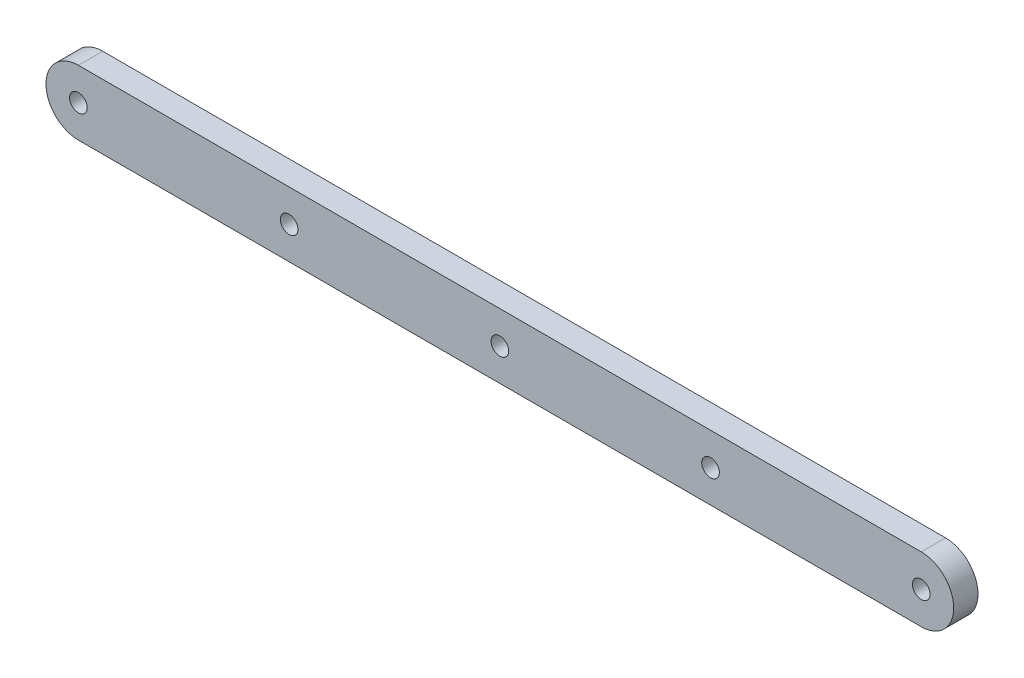
ISO-10303-21;
HEADER;
FILE_DESCRIPTION(('STEP AP214'),'2;1');
FILE_NAME('part.step','',(''),(''),'','','');
FILE_SCHEMA(('AUTOMOTIVE_DESIGN { 1 0 10303 214 1 1 1 1 }'));
ENDSEC;
DATA;
#1=APPLICATION_CONTEXT('core data for automotive mechanical design processes');
#2=APPLICATION_PROTOCOL_DEFINITION('international standard','automotive_design',2000,#1);
#3=PRODUCT_CONTEXT('',#1,'mechanical');
#4=PRODUCT('Part','Part','',(#3));
#5=PRODUCT_RELATED_PRODUCT_CATEGORY('part','',(#4));
#6=PRODUCT_DEFINITION_FORMATION('','',#4);
#7=PRODUCT_DEFINITION_CONTEXT('part definition',#1,'design');
#8=PRODUCT_DEFINITION('design','',#6,#7);
#9=PRODUCT_DEFINITION_SHAPE('','',#8);
#10=(LENGTH_UNIT() NAMED_UNIT(*) SI_UNIT(.MILLI.,.METRE.));
#11=(NAMED_UNIT(*) PLANE_ANGLE_UNIT() SI_UNIT($,.RADIAN.));
#12=(NAMED_UNIT(*) SI_UNIT($,.STERADIAN.) SOLID_ANGLE_UNIT());
#13=UNCERTAINTY_MEASURE_WITH_UNIT(LENGTH_MEASURE(1.E-05),#10,'distance_accuracy_value','');
#14=(GEOMETRIC_REPRESENTATION_CONTEXT(3) GLOBAL_UNCERTAINTY_ASSIGNED_CONTEXT((#13)) GLOBAL_UNIT_ASSIGNED_CONTEXT((#10,
#11,#12)) REPRESENTATION_CONTEXT('',''));
#15=CARTESIAN_POINT('',(0.,0.,0.));
#16=DIRECTION('',(0.,0.,1.));
#17=DIRECTION('',(1.,0.,0.));
#18=AXIS2_PLACEMENT_3D('',#15,#16,#17);
#19=CARTESIAN_POINT('',(82.55,6.35,4.7625));
#20=DIRECTION('',(0.,0.,-1.));
#21=DIRECTION('',(-1.,0.,0.));
#22=AXIS2_PLACEMENT_3D('',#19,#20,#21);
#23=CYLINDRICAL_SURFACE('',#22,6.35);
#24=CARTESIAN_POINT('',(82.55,6.35,0.));
#25=DIRECTION('',(0.,0.,1.));
#26=DIRECTION('',(1.,0.,0.));
#27=AXIS2_PLACEMENT_3D('',#24,#25,#26);
#28=CIRCLE('',#27,6.35);
#29=CARTESIAN_POINT('',(82.55,0.,0.));
#30=VERTEX_POINT('',#29);
#31=CARTESIAN_POINT('',(82.55,12.7,0.));
#32=VERTEX_POINT('',#31);
#33=EDGE_CURVE('E103',#30,#32,#28,.T.);
#34=ORIENTED_EDGE('',*,*,#33,.T.);
#35=DIRECTION('',(0.,0.,-1.));
#36=VECTOR('',#35,1.);
#37=CARTESIAN_POINT('',(82.55,12.7,4.7625));
#38=LINE('',#37,#36);
#39=CARTESIAN_POINT('',(82.55,12.7,4.7625));
#40=VERTEX_POINT('',#39);
#41=EDGE_CURVE('E11',#40,#32,#38,.T.);
#42=ORIENTED_EDGE('',*,*,#41,.F.);
#43=CARTESIAN_POINT('',(82.55,6.35,4.7625));
#44=DIRECTION('',(0.,0.,1.));
#45=DIRECTION('',(1.,0.,0.));
#46=AXIS2_PLACEMENT_3D('',#43,#44,#45);
#47=CIRCLE('',#46,6.35);
#48=CARTESIAN_POINT('',(82.55,0.,4.7625));
#49=VERTEX_POINT('',#48);
#50=EDGE_CURVE('E90',#49,#40,#47,.T.);
#51=ORIENTED_EDGE('',*,*,#50,.F.);
#52=DIRECTION('',(0.,0.,-1.));
#53=VECTOR('',#52,1.);
#54=CARTESIAN_POINT('',(82.55,0.,4.7625));
#55=LINE('',#54,#53);
#56=EDGE_CURVE('E99',#49,#30,#55,.T.);
#57=ORIENTED_EDGE('',*,*,#56,.T.);
#58=EDGE_LOOP('',(#34,#42,#51,#57));
#59=FACE_BOUND('',#58,.T.);
#60=ADVANCED_FACE('F37',(#59),#23,.T.);
#61=CARTESIAN_POINT('',(-82.55,12.7,4.7625));
#62=DIRECTION('',(0.,-1.,0.));
#63=DIRECTION('',(0.,0.,-1.));
#64=AXIS2_PLACEMENT_3D('',#61,#62,#63);
#65=PLANE('',#64);
#66=DIRECTION('',(-1.,0.,0.));
#67=VECTOR('',#66,1.);
#68=CARTESIAN_POINT('',(-82.55,12.7,0.));
#69=LINE('',#68,#67);
#70=CARTESIAN_POINT('',(-82.55,12.7,0.));
#71=VERTEX_POINT('',#70);
#72=EDGE_CURVE('E94',#32,#71,#69,.T.);
#73=ORIENTED_EDGE('',*,*,#72,.T.);
#74=DIRECTION('',(0.,0.,-1.));
#75=VECTOR('',#74,1.);
#76=CARTESIAN_POINT('',(-82.55,12.7,4.7625));
#77=LINE('',#76,#75);
#78=CARTESIAN_POINT('',(-82.55,12.7,4.7625));
#79=VERTEX_POINT('',#78);
#80=EDGE_CURVE('E46',#79,#71,#77,.T.);
#81=ORIENTED_EDGE('',*,*,#80,.F.);
#82=DIRECTION('',(-1.,0.,0.));
#83=VECTOR('',#82,1.);
#84=CARTESIAN_POINT('',(-82.55,12.7,4.7625));
#85=LINE('',#84,#83);
#86=EDGE_CURVE('E85',#40,#79,#85,.T.);
#87=ORIENTED_EDGE('',*,*,#86,.F.);
#88=ORIENTED_EDGE('',*,*,#41,.T.);
#89=EDGE_LOOP('',(#73,#81,#87,#88));
#90=FACE_BOUND('',#89,.T.);
#91=ADVANCED_FACE('F93',(#90),#65,.F.);
#92=CARTESIAN_POINT('',(-82.55,6.35,4.7625));
#93=DIRECTION('',(0.,0.,-1.));
#94=DIRECTION('',(-1.,0.,0.));
#95=AXIS2_PLACEMENT_3D('',#92,#93,#94);
#96=CYLINDRICAL_SURFACE('',#95,6.35);
#97=CARTESIAN_POINT('',(-82.55,6.35,0.));
#98=DIRECTION('',(0.,0.,1.));
#99=DIRECTION('',(-1.,0.,0.));
#100=AXIS2_PLACEMENT_3D('',#97,#98,#99);
#101=CIRCLE('',#100,6.35);
#102=CARTESIAN_POINT('',(-82.55,0.,0.));
#103=VERTEX_POINT('',#102);
#104=EDGE_CURVE('E72',#71,#103,#101,.T.);
#105=ORIENTED_EDGE('',*,*,#104,.T.);
#106=DIRECTION('',(0.,0.,-1.));
#107=VECTOR('',#106,1.);
#108=CARTESIAN_POINT('',(-82.55,0.,4.7625));
#109=LINE('',#108,#107);
#110=CARTESIAN_POINT('',(-82.55,0.,4.7625));
#111=VERTEX_POINT('',#110);
#112=EDGE_CURVE('E95',#111,#103,#109,.T.);
#113=ORIENTED_EDGE('',*,*,#112,.F.);
#114=CARTESIAN_POINT('',(-82.55,6.35,4.7625));
#115=DIRECTION('',(0.,0.,1.));
#116=DIRECTION('',(-1.,0.,0.));
#117=AXIS2_PLACEMENT_3D('',#114,#115,#116);
#118=CIRCLE('',#117,6.35);
#119=EDGE_CURVE('E88',#79,#111,#118,.T.);
#120=ORIENTED_EDGE('',*,*,#119,.F.);
#121=ORIENTED_EDGE('',*,*,#80,.T.);
#122=EDGE_LOOP('',(#105,#113,#120,#121));
#123=FACE_BOUND('',#122,.T.);
#124=ADVANCED_FACE('F97',(#123),#96,.T.);
#125=CARTESIAN_POINT('',(-82.55,0.,4.7625));
#126=DIRECTION('',(0.,1.,0.));
#127=DIRECTION('',(0.,0.,1.));
#128=AXIS2_PLACEMENT_3D('',#125,#126,#127);
#129=PLANE('',#128);
#130=DIRECTION('',(1.,0.,0.));
#131=VECTOR('',#130,1.);
#132=CARTESIAN_POINT('',(-82.55,0.,0.));
#133=LINE('',#132,#131);
#134=EDGE_CURVE('E78',#103,#30,#133,.T.);
#135=ORIENTED_EDGE('',*,*,#134,.T.);
#136=ORIENTED_EDGE('',*,*,#56,.F.);
#137=DIRECTION('',(1.,0.,0.));
#138=VECTOR('',#137,1.);
#139=CARTESIAN_POINT('',(-82.55,0.,4.7625));
#140=LINE('',#139,#138);
#141=EDGE_CURVE('E55',#111,#49,#140,.T.);
#142=ORIENTED_EDGE('',*,*,#141,.F.);
#143=ORIENTED_EDGE('',*,*,#112,.T.);
#144=EDGE_LOOP('',(#135,#136,#142,#143));
#145=FACE_BOUND('',#144,.T.);
#146=ADVANCED_FACE('F147',(#145),#129,.F.);
#147=CARTESIAN_POINT('',(82.55,6.35,4.7625));
#148=DIRECTION('',(0.,0.,1.));
#149=DIRECTION('',(1.,0.,0.));
#150=AXIS2_PLACEMENT_3D('',#147,#148,#149);
#151=PLANE('',#150);
#152=CARTESIAN_POINT('',(-82.55,6.35,4.7625));
#153=DIRECTION('',(0.,0.,1.));
#154=DIRECTION('',(1.,0.,0.));
#155=AXIS2_PLACEMENT_3D('',#152,#153,#154);
#156=CIRCLE('',#155,1.72719999999998);
#157=CARTESIAN_POINT('',(-80.8228,6.35,4.7625));
#158=VERTEX_POINT('',#157);
#159=EDGE_CURVE('E131',#158,#158,#156,.T.);
#160=ORIENTED_EDGE('',*,*,#159,.F.);
#161=EDGE_LOOP('',(#160));
#162=FACE_BOUND('',#161,.T.);
#163=CARTESIAN_POINT('',(82.55,6.35,4.7625));
#164=DIRECTION('',(0.,0.,1.));
#165=DIRECTION('',(1.,0.,0.));
#166=AXIS2_PLACEMENT_3D('',#163,#164,#165);
#167=CIRCLE('',#166,1.72719999999998);
#168=CARTESIAN_POINT('',(84.2772,6.35,4.7625));
#169=VERTEX_POINT('',#168);
#170=EDGE_CURVE('E121',#169,#169,#167,.T.);
#171=ORIENTED_EDGE('',*,*,#170,.F.);
#172=EDGE_LOOP('',(#171));
#173=FACE_BOUND('',#172,.T.);
#174=CARTESIAN_POINT('',(0.,6.35,4.7625));
#175=DIRECTION('',(0.,0.,1.));
#176=DIRECTION('',(1.,0.,0.));
#177=AXIS2_PLACEMENT_3D('',#174,#175,#176);
#178=CIRCLE('',#177,1.72719999999999);
#179=CARTESIAN_POINT('',(1.72719999999999,6.35,4.7625));
#180=VERTEX_POINT('',#179);
#181=EDGE_CURVE('E118',#180,#180,#178,.T.);
#182=ORIENTED_EDGE('',*,*,#181,.F.);
#183=EDGE_LOOP('',(#182));
#184=FACE_BOUND('',#183,.T.);
#185=CARTESIAN_POINT('',(41.2715213799497,6.35,4.7625));
#186=DIRECTION('',(0.,0.,1.));
#187=DIRECTION('',(1.,0.,0.));
#188=AXIS2_PLACEMENT_3D('',#185,#186,#187);
#189=CIRCLE('',#188,1.72719999999999);
#190=CARTESIAN_POINT('',(42.9987213799497,6.35,4.7625));
#191=VERTEX_POINT('',#190);
#192=EDGE_CURVE('E117',#191,#191,#189,.T.);
#193=ORIENTED_EDGE('',*,*,#192,.F.);
#194=EDGE_LOOP('',(#193));
#195=FACE_BOUND('',#194,.T.);
#196=CARTESIAN_POINT('',(-41.2760709235401,6.35,4.7625));
#197=DIRECTION('',(0.,0.,1.));
#198=DIRECTION('',(1.,0.,0.));
#199=AXIS2_PLACEMENT_3D('',#196,#197,#198);
#200=CIRCLE('',#199,1.72719999999999);
#201=CARTESIAN_POINT('',(-39.5488709235401,6.35,4.7625));
#202=VERTEX_POINT('',#201);
#203=EDGE_CURVE('E114',#202,#202,#200,.T.);
#204=ORIENTED_EDGE('',*,*,#203,.F.);
#205=EDGE_LOOP('',(#204));
#206=FACE_BOUND('',#205,.T.);
#207=ORIENTED_EDGE('',*,*,#50,.T.);
#208=ORIENTED_EDGE('',*,*,#86,.T.);
#209=ORIENTED_EDGE('',*,*,#119,.T.);
#210=ORIENTED_EDGE('',*,*,#141,.T.);
#211=EDGE_LOOP('',(#207,#208,#209,#210));
#212=FACE_BOUND('',#211,.T.);
#213=ADVANCED_FACE('F86',(#162,#173,#184,#195,#206,#212),#151,.T.);
#214=CARTESIAN_POINT('',(82.55,6.35,0.));
#215=DIRECTION('',(0.,0.,1.));
#216=DIRECTION('',(1.,0.,0.));
#217=AXIS2_PLACEMENT_3D('',#214,#215,#216);
#218=PLANE('',#217);
#219=CARTESIAN_POINT('',(-82.55,6.35,0.));
#220=DIRECTION('',(0.,0.,1.));
#221=DIRECTION('',(1.,0.,0.));
#222=AXIS2_PLACEMENT_3D('',#219,#220,#221);
#223=CIRCLE('',#222,1.72719999999998);
#224=CARTESIAN_POINT('',(-80.8228,6.35,0.));
#225=VERTEX_POINT('',#224);
#226=EDGE_CURVE('E40',#225,#225,#223,.T.);
#227=ORIENTED_EDGE('',*,*,#226,.T.);
#228=EDGE_LOOP('',(#227));
#229=FACE_BOUND('',#228,.T.);
#230=CARTESIAN_POINT('',(82.55,6.35,0.));
#231=DIRECTION('',(0.,0.,1.));
#232=DIRECTION('',(1.,0.,0.));
#233=AXIS2_PLACEMENT_3D('',#230,#231,#232);
#234=CIRCLE('',#233,1.72719999999998);
#235=CARTESIAN_POINT('',(84.2772,6.35,0.));
#236=VERTEX_POINT('',#235);
#237=EDGE_CURVE('E119',#236,#236,#234,.T.);
#238=ORIENTED_EDGE('',*,*,#237,.T.);
#239=EDGE_LOOP('',(#238));
#240=FACE_BOUND('',#239,.T.);
#241=CARTESIAN_POINT('',(0.,6.35,0.));
#242=DIRECTION('',(0.,0.,1.));
#243=DIRECTION('',(1.,0.,0.));
#244=AXIS2_PLACEMENT_3D('',#241,#242,#243);
#245=CIRCLE('',#244,1.72719999999999);
#246=CARTESIAN_POINT('',(1.72719999999999,6.35,0.));
#247=VERTEX_POINT('',#246);
#248=EDGE_CURVE('E115',#247,#247,#245,.T.);
#249=ORIENTED_EDGE('',*,*,#248,.T.);
#250=EDGE_LOOP('',(#249));
#251=FACE_BOUND('',#250,.T.);
#252=CARTESIAN_POINT('',(41.2715213799497,6.35,0.));
#253=DIRECTION('',(0.,0.,1.));
#254=DIRECTION('',(1.,0.,0.));
#255=AXIS2_PLACEMENT_3D('',#252,#253,#254);
#256=CIRCLE('',#255,1.72719999999999);
#257=CARTESIAN_POINT('',(42.9987213799497,6.35,0.));
#258=VERTEX_POINT('',#257);
#259=EDGE_CURVE('E136',#258,#258,#256,.T.);
#260=ORIENTED_EDGE('',*,*,#259,.T.);
#261=EDGE_LOOP('',(#260));
#262=FACE_BOUND('',#261,.T.);
#263=CARTESIAN_POINT('',(-41.2760709235401,6.35,0.));
#264=DIRECTION('',(0.,0.,1.));
#265=DIRECTION('',(1.,0.,0.));
#266=AXIS2_PLACEMENT_3D('',#263,#264,#265);
#267=CIRCLE('',#266,1.72719999999999);
#268=CARTESIAN_POINT('',(-39.5488709235401,6.35,0.));
#269=VERTEX_POINT('',#268);
#270=EDGE_CURVE('E106',#269,#269,#267,.T.);
#271=ORIENTED_EDGE('',*,*,#270,.T.);
#272=EDGE_LOOP('',(#271));
#273=FACE_BOUND('',#272,.T.);
#274=ORIENTED_EDGE('',*,*,#33,.F.);
#275=ORIENTED_EDGE('',*,*,#134,.F.);
#276=ORIENTED_EDGE('',*,*,#104,.F.);
#277=ORIENTED_EDGE('',*,*,#72,.F.);
#278=EDGE_LOOP('',(#274,#275,#276,#277));
#279=FACE_BOUND('',#278,.T.);
#280=ADVANCED_FACE('F146',(#229,#240,#251,#262,#273,#279),#218,.F.);
#281=CARTESIAN_POINT('',(-41.2760709235401,6.35,4.7625));
#282=DIRECTION('',(0.,0.,1.));
#283=DIRECTION('',(1.,0.,0.));
#284=AXIS2_PLACEMENT_3D('',#281,#282,#283);
#285=CYLINDRICAL_SURFACE('',#284,1.72719999999999);
#286=ORIENTED_EDGE('',*,*,#203,.T.);
#287=EDGE_LOOP('',(#286));
#288=FACE_BOUND('',#287,.T.);
#289=ORIENTED_EDGE('',*,*,#270,.F.);
#290=EDGE_LOOP('',(#289));
#291=FACE_BOUND('',#290,.T.);
#292=ADVANCED_FACE('F142',(#288,#291),#285,.F.);
#293=CARTESIAN_POINT('',(41.2715213799497,6.35,4.7625));
#294=DIRECTION('',(0.,0.,1.));
#295=DIRECTION('',(1.,0.,0.));
#296=AXIS2_PLACEMENT_3D('',#293,#294,#295);
#297=CYLINDRICAL_SURFACE('',#296,1.72719999999999);
#298=ORIENTED_EDGE('',*,*,#192,.T.);
#299=EDGE_LOOP('',(#298));
#300=FACE_BOUND('',#299,.T.);
#301=ORIENTED_EDGE('',*,*,#259,.F.);
#302=EDGE_LOOP('',(#301));
#303=FACE_BOUND('',#302,.T.);
#304=ADVANCED_FACE('F197',(#300,#303),#297,.F.);
#305=CARTESIAN_POINT('',(0.,6.35,4.7625));
#306=DIRECTION('',(0.,0.,1.));
#307=DIRECTION('',(1.,0.,0.));
#308=AXIS2_PLACEMENT_3D('',#305,#306,#307);
#309=CYLINDRICAL_SURFACE('',#308,1.72719999999999);
#310=ORIENTED_EDGE('',*,*,#181,.T.);
#311=EDGE_LOOP('',(#310));
#312=FACE_BOUND('',#311,.T.);
#313=ORIENTED_EDGE('',*,*,#248,.F.);
#314=EDGE_LOOP('',(#313));
#315=FACE_BOUND('',#314,.T.);
#316=ADVANCED_FACE('F207',(#312,#315),#309,.F.);
#317=CARTESIAN_POINT('',(82.55,6.35,4.7625));
#318=DIRECTION('',(0.,0.,1.));
#319=DIRECTION('',(1.,0.,0.));
#320=AXIS2_PLACEMENT_3D('',#317,#318,#319);
#321=CYLINDRICAL_SURFACE('',#320,1.72719999999998);
#322=ORIENTED_EDGE('',*,*,#170,.T.);
#323=EDGE_LOOP('',(#322));
#324=FACE_BOUND('',#323,.T.);
#325=ORIENTED_EDGE('',*,*,#237,.F.);
#326=EDGE_LOOP('',(#325));
#327=FACE_BOUND('',#326,.T.);
#328=ADVANCED_FACE('F217',(#324,#327),#321,.F.);
#329=CARTESIAN_POINT('',(-82.55,6.35,4.7625));
#330=DIRECTION('',(0.,0.,1.));
#331=DIRECTION('',(1.,0.,0.));
#332=AXIS2_PLACEMENT_3D('',#329,#330,#331);
#333=CYLINDRICAL_SURFACE('',#332,1.72719999999998);
#334=ORIENTED_EDGE('',*,*,#159,.T.);
#335=EDGE_LOOP('',(#334));
#336=FACE_BOUND('',#335,.T.);
#337=ORIENTED_EDGE('',*,*,#226,.F.);
#338=EDGE_LOOP('',(#337));
#339=FACE_BOUND('',#338,.T.);
#340=ADVANCED_FACE('F228',(#336,#339),#333,.F.);
#341=CLOSED_SHELL('',(#60,#91,#124,#146,#213,#280,#292,#304,#316,#328,#340));
#342=MANIFOLD_SOLID_BREP('B2',#341);
#343=ADVANCED_BREP_SHAPE_REPRESENTATION('',(#18,#342),#14);
#344=SHAPE_DEFINITION_REPRESENTATION(#9,#343);
ENDSEC;
END-ISO-10303-21;
